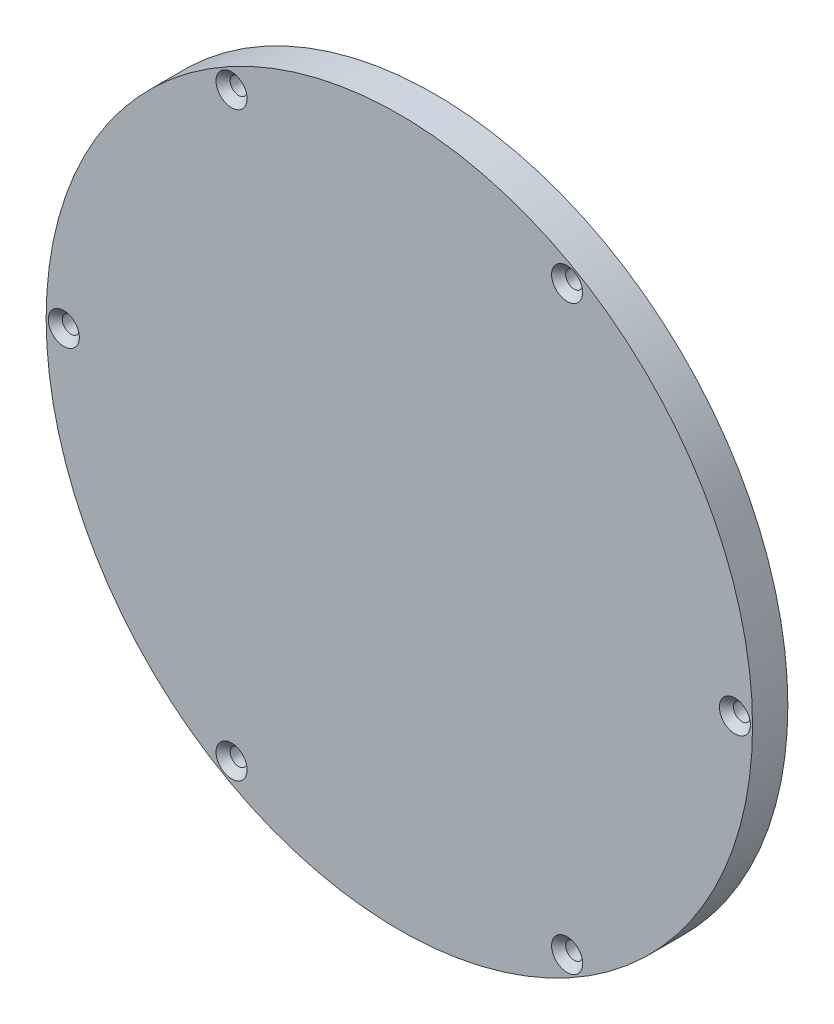
ISO-10303-21;
HEADER;
FILE_DESCRIPTION(('STEP AP214'),'2;1');
FILE_NAME('part.step','',(''),(''),'','','');
FILE_SCHEMA(('AUTOMOTIVE_DESIGN { 1 0 10303 214 1 1 1 1 }'));
ENDSEC;
DATA;
#1=APPLICATION_CONTEXT('core data for automotive mechanical design processes');
#2=APPLICATION_PROTOCOL_DEFINITION('international standard','automotive_design',2000,#1);
#3=PRODUCT_CONTEXT('',#1,'mechanical');
#4=PRODUCT('Part','Part','',(#3));
#5=PRODUCT_RELATED_PRODUCT_CATEGORY('part','',(#4));
#6=PRODUCT_DEFINITION_FORMATION('','',#4);
#7=PRODUCT_DEFINITION_CONTEXT('part definition',#1,'design');
#8=PRODUCT_DEFINITION('design','',#6,#7);
#9=PRODUCT_DEFINITION_SHAPE('','',#8);
#10=(LENGTH_UNIT() NAMED_UNIT(*) SI_UNIT(.MILLI.,.METRE.));
#11=(NAMED_UNIT(*) PLANE_ANGLE_UNIT() SI_UNIT($,.RADIAN.));
#12=(NAMED_UNIT(*) SI_UNIT($,.STERADIAN.) SOLID_ANGLE_UNIT());
#13=UNCERTAINTY_MEASURE_WITH_UNIT(LENGTH_MEASURE(1.E-05),#10,'distance_accuracy_value','');
#14=(GEOMETRIC_REPRESENTATION_CONTEXT(3) GLOBAL_UNCERTAINTY_ASSIGNED_CONTEXT((#13)) GLOBAL_UNIT_ASSIGNED_CONTEXT((#10,
#11,#12)) REPRESENTATION_CONTEXT('',''));
#15=CARTESIAN_POINT('',(0.,0.,0.));
#16=DIRECTION('',(0.,0.,1.));
#17=DIRECTION('',(1.,0.,0.));
#18=AXIS2_PLACEMENT_3D('',#15,#16,#17);
#19=CARTESIAN_POINT('',(0.,0.,5.));
#20=DIRECTION('',(0.,0.,-1.));
#21=DIRECTION('',(-1.,0.,0.));
#22=AXIS2_PLACEMENT_3D('',#19,#20,#21);
#23=CYLINDRICAL_SURFACE('',#22,50.);
#24=CARTESIAN_POINT('',(0.,0.,5.));
#25=DIRECTION('',(0.,0.,1.));
#26=DIRECTION('',(1.,0.,0.));
#27=AXIS2_PLACEMENT_3D('',#24,#25,#26);
#28=CIRCLE('',#27,50.);
#29=CARTESIAN_POINT('',(50.,0.,5.));
#30=VERTEX_POINT('',#29);
#31=EDGE_CURVE('E10',#30,#30,#28,.T.);
#32=ORIENTED_EDGE('',*,*,#31,.F.);
#33=EDGE_LOOP('',(#32));
#34=FACE_BOUND('',#33,.T.);
#35=CARTESIAN_POINT('',(0.,0.,0.));
#36=DIRECTION('',(0.,0.,1.));
#37=DIRECTION('',(1.,0.,0.));
#38=AXIS2_PLACEMENT_3D('',#35,#36,#37);
#39=CIRCLE('',#38,50.);
#40=CARTESIAN_POINT('',(50.,0.,0.));
#41=VERTEX_POINT('',#40);
#42=EDGE_CURVE('E35',#41,#41,#39,.T.);
#43=ORIENTED_EDGE('',*,*,#42,.T.);
#44=EDGE_LOOP('',(#43));
#45=FACE_BOUND('',#44,.T.);
#46=ADVANCED_FACE('F32',(#34,#45),#23,.T.);
#47=CARTESIAN_POINT('',(0.,0.,5.));
#48=DIRECTION('',(0.,0.,1.));
#49=DIRECTION('',(1.,0.,0.));
#50=AXIS2_PLACEMENT_3D('',#47,#48,#49);
#51=PLANE('',#50);
#52=CARTESIAN_POINT('',(-23.7500000000005,41.1362066797606,5.));
#53=DIRECTION('',(0.,0.,1.));
#54=DIRECTION('',(1.,0.,0.));
#55=AXIS2_PLACEMENT_3D('',#52,#53,#54);
#56=CIRCLE('',#55,2.2);
#57=CARTESIAN_POINT('',(-21.5500000000005,41.1362066797606,5.));
#58=VERTEX_POINT('',#57);
#59=EDGE_CURVE('E100',#58,#58,#56,.T.);
#60=ORIENTED_EDGE('',*,*,#59,.F.);
#61=EDGE_LOOP('',(#60));
#62=FACE_BOUND('',#61,.T.);
#63=CARTESIAN_POINT('',(23.7499999999996,41.1362066797611,5.));
#64=DIRECTION('',(0.,0.,1.));
#65=DIRECTION('',(1.,0.,0.));
#66=AXIS2_PLACEMENT_3D('',#63,#64,#65);
#67=CIRCLE('',#66,2.2);
#68=CARTESIAN_POINT('',(25.9499999999996,41.1362066797611,5.));
#69=VERTEX_POINT('',#68);
#70=EDGE_CURVE('E91',#69,#69,#67,.T.);
#71=ORIENTED_EDGE('',*,*,#70,.F.);
#72=EDGE_LOOP('',(#71));
#73=FACE_BOUND('',#72,.T.);
#74=CARTESIAN_POINT('',(47.5,0.,5.));
#75=DIRECTION('',(0.,0.,1.));
#76=DIRECTION('',(1.,0.,0.));
#77=AXIS2_PLACEMENT_3D('',#74,#75,#76);
#78=CIRCLE('',#77,2.2);
#79=CARTESIAN_POINT('',(49.7,0.,5.));
#80=VERTEX_POINT('',#79);
#81=EDGE_CURVE('E82',#80,#80,#78,.T.);
#82=ORIENTED_EDGE('',*,*,#81,.F.);
#83=EDGE_LOOP('',(#82));
#84=FACE_BOUND('',#83,.T.);
#85=CARTESIAN_POINT('',(23.7500000000002,-41.1362066797607,5.));
#86=DIRECTION('',(0.,0.,1.));
#87=DIRECTION('',(1.,0.,0.));
#88=AXIS2_PLACEMENT_3D('',#85,#86,#87);
#89=CIRCLE('',#88,2.2);
#90=CARTESIAN_POINT('',(25.9500000000002,-41.1362066797607,5.));
#91=VERTEX_POINT('',#90);
#92=EDGE_CURVE('E73',#91,#91,#89,.T.);
#93=ORIENTED_EDGE('',*,*,#92,.F.);
#94=EDGE_LOOP('',(#93));
#95=FACE_BOUND('',#94,.T.);
#96=CARTESIAN_POINT('',(-23.7499999999999,-41.1362066797609,5.));
#97=DIRECTION('',(0.,0.,1.));
#98=DIRECTION('',(1.,0.,0.));
#99=AXIS2_PLACEMENT_3D('',#96,#97,#98);
#100=CIRCLE('',#99,2.2);
#101=CARTESIAN_POINT('',(-21.5499999999999,-41.1362066797609,5.));
#102=VERTEX_POINT('',#101);
#103=EDGE_CURVE('E64',#102,#102,#100,.T.);
#104=ORIENTED_EDGE('',*,*,#103,.F.);
#105=EDGE_LOOP('',(#104));
#106=FACE_BOUND('',#105,.T.);
#107=CARTESIAN_POINT('',(-47.5,0.,5.));
#108=DIRECTION('',(0.,0.,1.));
#109=DIRECTION('',(1.,0.,0.));
#110=AXIS2_PLACEMENT_3D('',#107,#108,#109);
#111=CIRCLE('',#110,2.2);
#112=CARTESIAN_POINT('',(-45.3,0.,5.));
#113=VERTEX_POINT('',#112);
#114=EDGE_CURVE('E55',#113,#113,#111,.T.);
#115=ORIENTED_EDGE('',*,*,#114,.F.);
#116=EDGE_LOOP('',(#115));
#117=FACE_BOUND('',#116,.T.);
#118=ORIENTED_EDGE('',*,*,#31,.T.);
#119=EDGE_LOOP('',(#118));
#120=FACE_BOUND('',#119,.T.);
#121=ADVANCED_FACE('F106',(#62,#73,#84,#95,#106,#117,#120),#51,.T.);
#122=CARTESIAN_POINT('',(0.,0.,0.));
#123=DIRECTION('',(0.,0.,1.));
#124=DIRECTION('',(1.,0.,0.));
#125=AXIS2_PLACEMENT_3D('',#122,#123,#124);
#126=PLANE('',#125);
#127=CARTESIAN_POINT('',(-23.7500000000005,41.1362066797606,0.));
#128=DIRECTION('',(0.,0.,1.));
#129=DIRECTION('',(1.,0.,0.));
#130=AXIS2_PLACEMENT_3D('',#127,#128,#129);
#131=CIRCLE('',#130,1.19999999999999);
#132=CARTESIAN_POINT('',(-22.5500000000005,41.1362066797606,0.));
#133=VERTEX_POINT('',#132);
#134=EDGE_CURVE('E94',#133,#133,#131,.T.);
#135=ORIENTED_EDGE('',*,*,#134,.T.);
#136=EDGE_LOOP('',(#135));
#137=FACE_BOUND('',#136,.T.);
#138=CARTESIAN_POINT('',(23.7499999999996,41.1362066797611,0.));
#139=DIRECTION('',(0.,0.,1.));
#140=DIRECTION('',(1.,0.,0.));
#141=AXIS2_PLACEMENT_3D('',#138,#139,#140);
#142=CIRCLE('',#141,1.19999999999999);
#143=CARTESIAN_POINT('',(24.9499999999996,41.1362066797611,0.));
#144=VERTEX_POINT('',#143);
#145=EDGE_CURVE('E85',#144,#144,#142,.T.);
#146=ORIENTED_EDGE('',*,*,#145,.T.);
#147=EDGE_LOOP('',(#146));
#148=FACE_BOUND('',#147,.T.);
#149=CARTESIAN_POINT('',(47.5,0.,0.));
#150=DIRECTION('',(0.,0.,1.));
#151=DIRECTION('',(1.,0.,0.));
#152=AXIS2_PLACEMENT_3D('',#149,#150,#151);
#153=CIRCLE('',#152,1.19999999999999);
#154=CARTESIAN_POINT('',(48.7,0.,0.));
#155=VERTEX_POINT('',#154);
#156=EDGE_CURVE('E76',#155,#155,#153,.T.);
#157=ORIENTED_EDGE('',*,*,#156,.T.);
#158=EDGE_LOOP('',(#157));
#159=FACE_BOUND('',#158,.T.);
#160=CARTESIAN_POINT('',(23.7500000000002,-41.1362066797607,0.));
#161=DIRECTION('',(0.,0.,1.));
#162=DIRECTION('',(1.,0.,0.));
#163=AXIS2_PLACEMENT_3D('',#160,#161,#162);
#164=CIRCLE('',#163,1.19999999999999);
#165=CARTESIAN_POINT('',(24.9500000000002,-41.1362066797607,0.));
#166=VERTEX_POINT('',#165);
#167=EDGE_CURVE('E67',#166,#166,#164,.T.);
#168=ORIENTED_EDGE('',*,*,#167,.T.);
#169=EDGE_LOOP('',(#168));
#170=FACE_BOUND('',#169,.T.);
#171=CARTESIAN_POINT('',(-23.7499999999999,-41.1362066797609,0.));
#172=DIRECTION('',(0.,0.,1.));
#173=DIRECTION('',(1.,0.,0.));
#174=AXIS2_PLACEMENT_3D('',#171,#172,#173);
#175=CIRCLE('',#174,1.19999999999999);
#176=CARTESIAN_POINT('',(-22.5499999999999,-41.1362066797609,0.));
#177=VERTEX_POINT('',#176);
#178=EDGE_CURVE('E58',#177,#177,#175,.T.);
#179=ORIENTED_EDGE('',*,*,#178,.T.);
#180=EDGE_LOOP('',(#179));
#181=FACE_BOUND('',#180,.T.);
#182=CARTESIAN_POINT('',(-47.5,0.,0.));
#183=DIRECTION('',(0.,0.,1.));
#184=DIRECTION('',(1.,0.,0.));
#185=AXIS2_PLACEMENT_3D('',#182,#183,#184);
#186=CIRCLE('',#185,1.19999999999999);
#187=CARTESIAN_POINT('',(-46.3,0.,0.));
#188=VERTEX_POINT('',#187);
#189=EDGE_CURVE('E47',#188,#188,#186,.T.);
#190=ORIENTED_EDGE('',*,*,#189,.T.);
#191=EDGE_LOOP('',(#190));
#192=FACE_BOUND('',#191,.T.);
#193=CARTESIAN_POINT('',(0.,0.,0.));
#194=DIRECTION('',(0.,0.,-1.));
#195=DIRECTION('',(-1.,0.,0.));
#196=AXIS2_PLACEMENT_3D('',#193,#194,#195);
#197=CIRCLE('',#196,3.);
#198=CARTESIAN_POINT('',(-3.,0.,0.));
#199=VERTEX_POINT('',#198);
#200=EDGE_CURVE('E44',#199,#199,#197,.T.);
#201=ORIENTED_EDGE('',*,*,#200,.F.);
#202=EDGE_LOOP('',(#201));
#203=FACE_BOUND('',#202,.T.);
#204=ORIENTED_EDGE('',*,*,#42,.F.);
#205=EDGE_LOOP('',(#204));
#206=FACE_BOUND('',#205,.T.);
#207=ADVANCED_FACE('F109',(#137,#148,#159,#170,#181,#192,#203,#206),#126,.F.);
#208=CARTESIAN_POINT('',(0.,0.,4.));
#209=DIRECTION('',(0.,0.,-1.));
#210=DIRECTION('',(-1.,0.,0.));
#211=AXIS2_PLACEMENT_3D('',#208,#209,#210);
#212=CYLINDRICAL_SURFACE('',#211,3.);
#213=CARTESIAN_POINT('',(0.,0.,4.));
#214=DIRECTION('',(0.,0.,-1.));
#215=DIRECTION('',(-1.,0.,0.));
#216=AXIS2_PLACEMENT_3D('',#213,#214,#215);
#217=CIRCLE('',#216,3.);
#218=CARTESIAN_POINT('',(-3.,0.,4.));
#219=VERTEX_POINT('',#218);
#220=EDGE_CURVE('E42',#219,#219,#217,.T.);
#221=ORIENTED_EDGE('',*,*,#220,.F.);
#222=EDGE_LOOP('',(#221));
#223=FACE_BOUND('',#222,.T.);
#224=ORIENTED_EDGE('',*,*,#200,.T.);
#225=EDGE_LOOP('',(#224));
#226=FACE_BOUND('',#225,.T.);
#227=ADVANCED_FACE('F146',(#223,#226),#212,.F.);
#228=CARTESIAN_POINT('',(0.,0.,4.));
#229=DIRECTION('',(0.,0.,-1.));
#230=DIRECTION('',(-1.,0.,0.));
#231=AXIS2_PLACEMENT_3D('',#228,#229,#230);
#232=PLANE('',#231);
#233=ORIENTED_EDGE('',*,*,#220,.T.);
#234=EDGE_LOOP('',(#233));
#235=FACE_BOUND('',#234,.T.);
#236=ADVANCED_FACE('F134',(#235),#232,.T.);
#237=CARTESIAN_POINT('',(-47.5,0.,5.));
#238=DIRECTION('',(0.,0.,1.));
#239=DIRECTION('',(1.,0.,0.));
#240=AXIS2_PLACEMENT_3D('',#237,#238,#239);
#241=CYLINDRICAL_SURFACE('',#240,1.19999999999999);
#242=ORIENTED_EDGE('',*,*,#189,.F.);
#243=EDGE_LOOP('',(#242));
#244=FACE_BOUND('',#243,.T.);
#245=CARTESIAN_POINT('',(-47.5,0.,4.));
#246=DIRECTION('',(0.,0.,1.));
#247=DIRECTION('',(1.,0.,0.));
#248=AXIS2_PLACEMENT_3D('',#245,#246,#247);
#249=CIRCLE('',#248,1.2);
#250=CARTESIAN_POINT('',(-46.3,0.,4.));
#251=VERTEX_POINT('',#250);
#252=EDGE_CURVE('E52',#251,#251,#249,.T.);
#253=ORIENTED_EDGE('',*,*,#252,.T.);
#254=EDGE_LOOP('',(#253));
#255=FACE_BOUND('',#254,.T.);
#256=ADVANCED_FACE('F124',(#244,#255),#241,.F.);
#257=CARTESIAN_POINT('',(-47.5,0.,5.));
#258=DIRECTION('',(0.,0.,1.));
#259=DIRECTION('',(1.,0.,0.));
#260=AXIS2_PLACEMENT_3D('',#257,#258,#259);
#261=CONICAL_SURFACE('',#260,2.2,0.785398163397448);
#262=ORIENTED_EDGE('',*,*,#252,.F.);
#263=EDGE_LOOP('',(#262));
#264=FACE_BOUND('',#263,.T.);
#265=ORIENTED_EDGE('',*,*,#114,.T.);
#266=EDGE_LOOP('',(#265));
#267=FACE_BOUND('',#266,.T.);
#268=ADVANCED_FACE('F121',(#264,#267),#261,.F.);
#269=CARTESIAN_POINT('',(-23.7499999999999,-41.1362066797609,5.));
#270=DIRECTION('',(0.,0.,1.));
#271=DIRECTION('',(1.,0.,0.));
#272=AXIS2_PLACEMENT_3D('',#269,#270,#271);
#273=CYLINDRICAL_SURFACE('',#272,1.19999999999999);
#274=ORIENTED_EDGE('',*,*,#178,.F.);
#275=EDGE_LOOP('',(#274));
#276=FACE_BOUND('',#275,.T.);
#277=CARTESIAN_POINT('',(-23.7499999999999,-41.1362066797609,4.));
#278=DIRECTION('',(0.,0.,1.));
#279=DIRECTION('',(1.,0.,0.));
#280=AXIS2_PLACEMENT_3D('',#277,#278,#279);
#281=CIRCLE('',#280,1.2);
#282=CARTESIAN_POINT('',(-22.5499999999999,-41.1362066797609,4.));
#283=VERTEX_POINT('',#282);
#284=EDGE_CURVE('E61',#283,#283,#281,.T.);
#285=ORIENTED_EDGE('',*,*,#284,.T.);
#286=EDGE_LOOP('',(#285));
#287=FACE_BOUND('',#286,.T.);
#288=ADVANCED_FACE('F123',(#276,#287),#273,.F.);
#289=CARTESIAN_POINT('',(-23.7499999999999,-41.1362066797609,5.));
#290=DIRECTION('',(0.,0.,1.));
#291=DIRECTION('',(1.,0.,0.));
#292=AXIS2_PLACEMENT_3D('',#289,#290,#291);
#293=CONICAL_SURFACE('',#292,2.2,0.785398163397448);
#294=ORIENTED_EDGE('',*,*,#284,.F.);
#295=EDGE_LOOP('',(#294));
#296=FACE_BOUND('',#295,.T.);
#297=ORIENTED_EDGE('',*,*,#103,.T.);
#298=EDGE_LOOP('',(#297));
#299=FACE_BOUND('',#298,.T.);
#300=ADVANCED_FACE('F131',(#296,#299),#293,.F.);
#301=CARTESIAN_POINT('',(23.7500000000002,-41.1362066797607,5.));
#302=DIRECTION('',(0.,0.,1.));
#303=DIRECTION('',(1.,0.,0.));
#304=AXIS2_PLACEMENT_3D('',#301,#302,#303);
#305=CYLINDRICAL_SURFACE('',#304,1.19999999999999);
#306=ORIENTED_EDGE('',*,*,#167,.F.);
#307=EDGE_LOOP('',(#306));
#308=FACE_BOUND('',#307,.T.);
#309=CARTESIAN_POINT('',(23.7500000000002,-41.1362066797607,4.));
#310=DIRECTION('',(0.,0.,1.));
#311=DIRECTION('',(1.,0.,0.));
#312=AXIS2_PLACEMENT_3D('',#309,#310,#311);
#313=CIRCLE('',#312,1.2);
#314=CARTESIAN_POINT('',(24.9500000000002,-41.1362066797607,4.));
#315=VERTEX_POINT('',#314);
#316=EDGE_CURVE('E70',#315,#315,#313,.T.);
#317=ORIENTED_EDGE('',*,*,#316,.T.);
#318=EDGE_LOOP('',(#317));
#319=FACE_BOUND('',#318,.T.);
#320=ADVANCED_FACE('F200',(#308,#319),#305,.F.);
#321=CARTESIAN_POINT('',(23.7500000000002,-41.1362066797607,5.));
#322=DIRECTION('',(0.,0.,1.));
#323=DIRECTION('',(1.,0.,0.));
#324=AXIS2_PLACEMENT_3D('',#321,#322,#323);
#325=CONICAL_SURFACE('',#324,2.2,0.785398163397448);
#326=ORIENTED_EDGE('',*,*,#316,.F.);
#327=EDGE_LOOP('',(#326));
#328=FACE_BOUND('',#327,.T.);
#329=ORIENTED_EDGE('',*,*,#92,.T.);
#330=EDGE_LOOP('',(#329));
#331=FACE_BOUND('',#330,.T.);
#332=ADVANCED_FACE('F210',(#328,#331),#325,.F.);
#333=CARTESIAN_POINT('',(47.5,0.,5.));
#334=DIRECTION('',(0.,0.,1.));
#335=DIRECTION('',(1.,0.,0.));
#336=AXIS2_PLACEMENT_3D('',#333,#334,#335);
#337=CYLINDRICAL_SURFACE('',#336,1.19999999999999);
#338=ORIENTED_EDGE('',*,*,#156,.F.);
#339=EDGE_LOOP('',(#338));
#340=FACE_BOUND('',#339,.T.);
#341=CARTESIAN_POINT('',(47.5,0.,4.));
#342=DIRECTION('',(0.,0.,1.));
#343=DIRECTION('',(1.,0.,0.));
#344=AXIS2_PLACEMENT_3D('',#341,#342,#343);
#345=CIRCLE('',#344,1.2);
#346=CARTESIAN_POINT('',(48.7,0.,4.));
#347=VERTEX_POINT('',#346);
#348=EDGE_CURVE('E79',#347,#347,#345,.T.);
#349=ORIENTED_EDGE('',*,*,#348,.T.);
#350=EDGE_LOOP('',(#349));
#351=FACE_BOUND('',#350,.T.);
#352=ADVANCED_FACE('F220',(#340,#351),#337,.F.);
#353=CARTESIAN_POINT('',(47.5,0.,5.));
#354=DIRECTION('',(0.,0.,1.));
#355=DIRECTION('',(1.,0.,0.));
#356=AXIS2_PLACEMENT_3D('',#353,#354,#355);
#357=CONICAL_SURFACE('',#356,2.2,0.785398163397448);
#358=ORIENTED_EDGE('',*,*,#348,.F.);
#359=EDGE_LOOP('',(#358));
#360=FACE_BOUND('',#359,.T.);
#361=ORIENTED_EDGE('',*,*,#81,.T.);
#362=EDGE_LOOP('',(#361));
#363=FACE_BOUND('',#362,.T.);
#364=ADVANCED_FACE('F230',(#360,#363),#357,.F.);
#365=CARTESIAN_POINT('',(23.7499999999996,41.1362066797611,5.));
#366=DIRECTION('',(0.,0.,1.));
#367=DIRECTION('',(1.,0.,0.));
#368=AXIS2_PLACEMENT_3D('',#365,#366,#367);
#369=CYLINDRICAL_SURFACE('',#368,1.19999999999999);
#370=ORIENTED_EDGE('',*,*,#145,.F.);
#371=EDGE_LOOP('',(#370));
#372=FACE_BOUND('',#371,.T.);
#373=CARTESIAN_POINT('',(23.7499999999996,41.1362066797611,4.));
#374=DIRECTION('',(0.,0.,1.));
#375=DIRECTION('',(1.,0.,0.));
#376=AXIS2_PLACEMENT_3D('',#373,#374,#375);
#377=CIRCLE('',#376,1.2);
#378=CARTESIAN_POINT('',(24.9499999999996,41.1362066797611,4.));
#379=VERTEX_POINT('',#378);
#380=EDGE_CURVE('E88',#379,#379,#377,.T.);
#381=ORIENTED_EDGE('',*,*,#380,.T.);
#382=EDGE_LOOP('',(#381));
#383=FACE_BOUND('',#382,.T.);
#384=ADVANCED_FACE('F240',(#372,#383),#369,.F.);
#385=CARTESIAN_POINT('',(23.7499999999996,41.1362066797611,5.));
#386=DIRECTION('',(0.,0.,1.));
#387=DIRECTION('',(1.,0.,0.));
#388=AXIS2_PLACEMENT_3D('',#385,#386,#387);
#389=CONICAL_SURFACE('',#388,2.2,0.785398163397448);
#390=ORIENTED_EDGE('',*,*,#380,.F.);
#391=EDGE_LOOP('',(#390));
#392=FACE_BOUND('',#391,.T.);
#393=ORIENTED_EDGE('',*,*,#70,.T.);
#394=EDGE_LOOP('',(#393));
#395=FACE_BOUND('',#394,.T.);
#396=ADVANCED_FACE('F250',(#392,#395),#389,.F.);
#397=CARTESIAN_POINT('',(-23.7500000000005,41.1362066797606,5.));
#398=DIRECTION('',(0.,0.,1.));
#399=DIRECTION('',(1.,0.,0.));
#400=AXIS2_PLACEMENT_3D('',#397,#398,#399);
#401=CYLINDRICAL_SURFACE('',#400,1.19999999999999);
#402=ORIENTED_EDGE('',*,*,#134,.F.);
#403=EDGE_LOOP('',(#402));
#404=FACE_BOUND('',#403,.T.);
#405=CARTESIAN_POINT('',(-23.7500000000005,41.1362066797606,4.));
#406=DIRECTION('',(0.,0.,1.));
#407=DIRECTION('',(1.,0.,0.));
#408=AXIS2_PLACEMENT_3D('',#405,#406,#407);
#409=CIRCLE('',#408,1.2);
#410=CARTESIAN_POINT('',(-22.5500000000005,41.1362066797606,4.));
#411=VERTEX_POINT('',#410);
#412=EDGE_CURVE('E97',#411,#411,#409,.T.);
#413=ORIENTED_EDGE('',*,*,#412,.T.);
#414=EDGE_LOOP('',(#413));
#415=FACE_BOUND('',#414,.T.);
#416=ADVANCED_FACE('F260',(#404,#415),#401,.F.);
#417=CARTESIAN_POINT('',(-23.7500000000005,41.1362066797606,5.));
#418=DIRECTION('',(0.,0.,1.));
#419=DIRECTION('',(1.,0.,0.));
#420=AXIS2_PLACEMENT_3D('',#417,#418,#419);
#421=CONICAL_SURFACE('',#420,2.2,0.785398163397448);
#422=ORIENTED_EDGE('',*,*,#412,.F.);
#423=EDGE_LOOP('',(#422));
#424=FACE_BOUND('',#423,.T.);
#425=ORIENTED_EDGE('',*,*,#59,.T.);
#426=EDGE_LOOP('',(#425));
#427=FACE_BOUND('',#426,.T.);
#428=ADVANCED_FACE('F104',(#424,#427),#421,.F.);
#429=CLOSED_SHELL('',(#46,#121,#207,#227,#236,#256,#268,#288,#300,#320,#332,#352,#364,#384,#396,
#416,#428));
#430=MANIFOLD_SOLID_BREP('B2',#429);
#431=ADVANCED_BREP_SHAPE_REPRESENTATION('',(#18,#430),#14);
#432=SHAPE_DEFINITION_REPRESENTATION(#9,#431);
ENDSEC;
END-ISO-10303-21;
